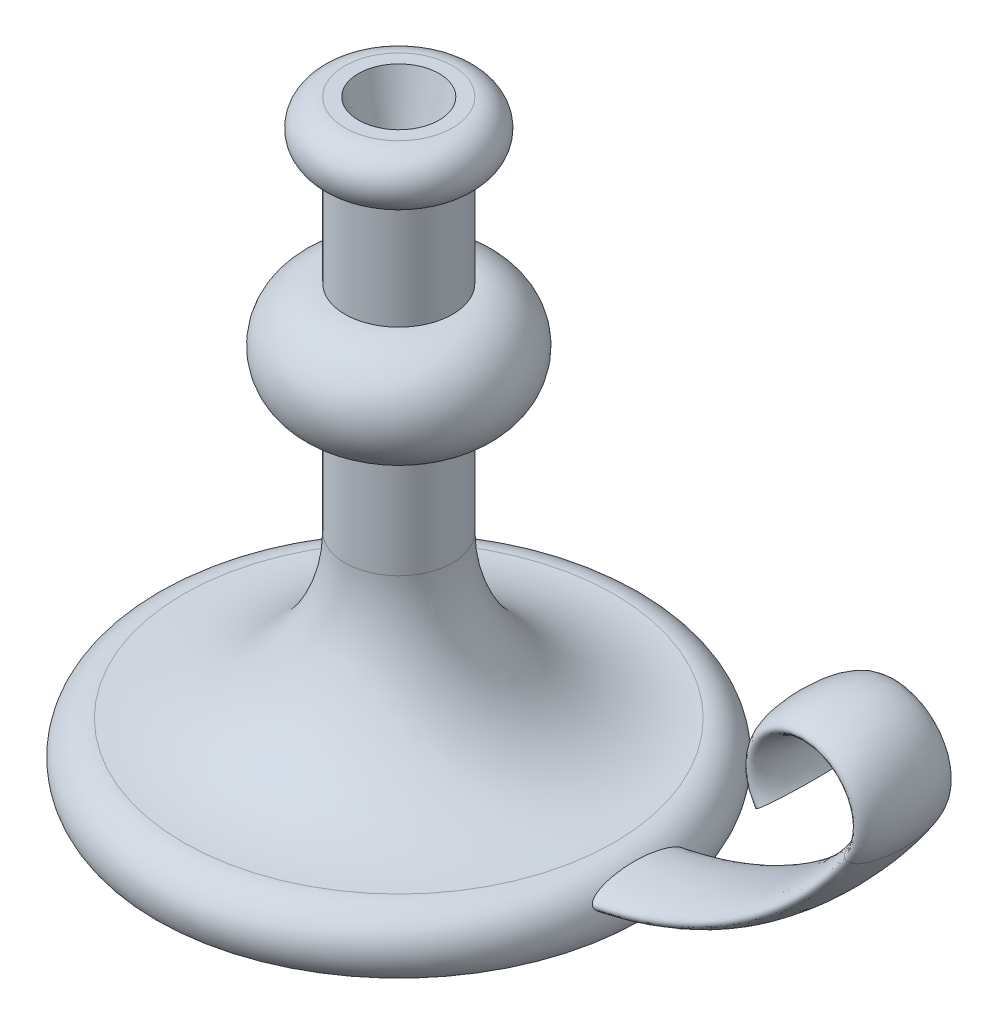
ISO-10303-21;
HEADER;
FILE_DESCRIPTION(('STEP AP214'),'2;1');
FILE_NAME('part.step','',(''),(''),'','','');
FILE_SCHEMA(('AUTOMOTIVE_DESIGN { 1 0 10303 214 1 1 1 1 }'));
ENDSEC;
DATA;
#1=APPLICATION_CONTEXT('core data for automotive mechanical design processes');
#2=APPLICATION_PROTOCOL_DEFINITION('international standard','automotive_design',2000,#1);
#3=PRODUCT_CONTEXT('',#1,'mechanical');
#4=PRODUCT('Part','Part','',(#3));
#5=PRODUCT_RELATED_PRODUCT_CATEGORY('part','',(#4));
#6=PRODUCT_DEFINITION_FORMATION('','',#4);
#7=PRODUCT_DEFINITION_CONTEXT('part definition',#1,'design');
#8=PRODUCT_DEFINITION('design','',#6,#7);
#9=PRODUCT_DEFINITION_SHAPE('','',#8);
#10=(LENGTH_UNIT() NAMED_UNIT(*) SI_UNIT(.MILLI.,.METRE.));
#11=(NAMED_UNIT(*) PLANE_ANGLE_UNIT() SI_UNIT($,.RADIAN.));
#12=(NAMED_UNIT(*) SI_UNIT($,.STERADIAN.) SOLID_ANGLE_UNIT());
#13=UNCERTAINTY_MEASURE_WITH_UNIT(LENGTH_MEASURE(1.E-05),#10,'distance_accuracy_value','');
#14=(GEOMETRIC_REPRESENTATION_CONTEXT(3) GLOBAL_UNCERTAINTY_ASSIGNED_CONTEXT((#13)) GLOBAL_UNIT_ASSIGNED_CONTEXT((#10,
#11,#12)) REPRESENTATION_CONTEXT('',''));
#15=CARTESIAN_POINT('',(0.,0.,0.));
#16=DIRECTION('',(0.,0.,1.));
#17=DIRECTION('',(1.,0.,0.));
#18=AXIS2_PLACEMENT_3D('',#15,#16,#17);
#19=CARTESIAN_POINT('',(0.,7.50000000000001,0.));
#20=DIRECTION('',(0.,1.,0.));
#21=DIRECTION('',(-1.,0.,0.));
#22=AXIS2_PLACEMENT_3D('',#19,#20,#21);
#23=TOROIDAL_SURFACE('',#22,80.,12.5);
#24=CARTESIAN_POINT('',(89.5597422043342,12.9414346567556,-17.5));
#25=CARTESIAN_POINT('',(89.5390618403561,12.9834100865229,-17.4999996776707));
#26=CARTESIAN_POINT('',(89.5184817634659,13.0254349004938,-17.4978446678338));
#27=CARTESIAN_POINT('',(89.4776811982743,13.1092324497794,-17.4892861575811));
#28=CARTESIAN_POINT('',(89.457460843071,13.1510050881611,-17.4828811168849));
#29=CARTESIAN_POINT('',(89.397540281121,13.2754779151414,-17.4575154450277));
#30=CARTESIAN_POINT('',(89.3585808220613,13.357332519418,-17.4324042670615));
#31=CARTESIAN_POINT('',(89.2734407804368,13.537917999339,-17.3597430943198));
#32=CARTESIAN_POINT('',(89.2281116968574,13.6353152430682,-17.3079906529225));
#33=CARTESIAN_POINT('',(89.1421567137609,13.821757010941,-17.1881654215547));
#34=CARTESIAN_POINT('',(89.1015409681601,13.9107834263932,-17.1200583326704));
#35=CARTESIAN_POINT('',(89.0298799325305,14.0690063055582,-16.9825317839868));
#36=CARTESIAN_POINT('',(88.9982856031081,14.1392491335227,-16.9145677994464));
#37=CARTESIAN_POINT('',(88.9378435588022,14.2742914925202,-16.7722502997375));
#38=CARTESIAN_POINT('',(88.9089980734781,14.3390866000317,-16.6978916893925));
#39=CARTESIAN_POINT('',(88.8536099995593,14.4639626152392,-16.5442177801531));
#40=CARTESIAN_POINT('',(88.8270733532936,14.5240313225779,-16.4648905452804));
#41=CARTESIAN_POINT('',(88.7760376587064,14.6398576639347,-16.3025863942461));
#42=CARTESIAN_POINT('',(88.7515379613228,14.6956166708124,-16.2196106536441));
#43=CARTESIAN_POINT('',(88.704732820549,14.8023169553036,-16.052427362784));
#44=CARTESIAN_POINT('',(88.6823939519366,14.8533308765833,-15.9682752160745));
#45=CARTESIAN_POINT('',(88.639155365759,14.9521540950118,-15.797741621076));
#46=CARTESIAN_POINT('',(88.6182558899722,14.9999628537458,-15.711359801597));
#47=CARTESIAN_POINT('',(88.5573681790009,15.1392585624724,-15.4492483073626));
#48=CARTESIAN_POINT('',(88.5192579811328,15.2264609786255,-15.2707999543232));
#49=CARTESIAN_POINT('',(88.4468979005836,15.3916731276291,-14.9088289385944));
#50=CARTESIAN_POINT('',(88.4126513155026,15.4696750103546,-14.725302105289));
#51=CARTESIAN_POINT('',(88.347139159504,15.6182965032923,-14.3538259785736));
#52=CARTESIAN_POINT('',(88.3158872528146,15.6888824046966,-14.1658608782527));
#53=CARTESIAN_POINT('',(88.2560127035516,15.8233792512431,-13.787400391854));
#54=CARTESIAN_POINT('',(88.2273872233002,15.8872974109117,-13.5969079973403));
#55=CARTESIAN_POINT('',(88.1723348827448,16.0094159388249,-13.213849673779));
#56=CARTESIAN_POINT('',(88.1459074726896,16.0676177374301,-13.021284276893));
#57=CARTESIAN_POINT('',(88.0884248304702,16.1932687928886,-12.5849658119247));
#58=CARTESIAN_POINT('',(88.0579162002184,16.2592725226906,-12.3407253521734));
#59=CARTESIAN_POINT('',(87.9994625659013,16.3844358500306,-11.8501803460782));
#60=CARTESIAN_POINT('',(87.9715178234088,16.4435947494062,-11.6038755919222));
#61=CARTESIAN_POINT('',(87.9178897421858,16.5558889779776,-11.109529987048));
#62=CARTESIAN_POINT('',(87.8922075114269,16.6090213595568,-10.86148834924));
#63=CARTESIAN_POINT('',(87.8429155378603,16.7098546386226,-10.3640943607018));
#64=CARTESIAN_POINT('',(87.8193058942812,16.7575552760879,-10.1147419478211));
#65=CARTESIAN_POINT('',(87.7514718906047,16.8930622945828,-9.36631396644906));
#66=CARTESIAN_POINT('',(87.710111419914,16.97354616682,-8.86564202060321));
#67=CARTESIAN_POINT('',(87.6344118706354,17.1178657179368,-7.86153551840237));
#68=CARTESIAN_POINT('',(87.600071334108,17.1817048544489,-7.35810155802573));
#69=CARTESIAN_POINT('',(87.5383679228555,17.2943697092708,-6.35225136111884));
#70=CARTESIAN_POINT('',(87.5109639050819,17.3432843238913,-5.84984753787566));
#71=CARTESIAN_POINT('',(87.4628391630611,17.4279603163538,-4.84354228831021));
#72=CARTESIAN_POINT('',(87.4421195253372,17.4637195559667,-4.339640631941));
#73=CARTESIAN_POINT('',(87.4074386787955,17.5229738360405,-3.33084363886024));
#74=CARTESIAN_POINT('',(87.3934780874882,17.5464677559496,-2.82594821558692));
#75=CARTESIAN_POINT('',(87.3724154174235,17.581727316861,-1.81615213380814));
#76=CARTESIAN_POINT('',(87.3653059747339,17.5935055508652,-1.31125206554532));
#77=CARTESIAN_POINT('',(87.3579750479624,17.605648406649,-0.301318309133024));
#78=CARTESIAN_POINT('',(87.357752858235,17.6060141977103,0.203715360025975));
#79=CARTESIAN_POINT('',(87.3641963426438,17.5953454261039,1.21356726554157));
#80=CARTESIAN_POINT('',(87.3708612610896,17.5843121142069,1.71838551945497));
#81=CARTESIAN_POINT('',(87.3886163883338,17.5546163065411,2.60695068649841));
#82=CARTESIAN_POINT('',(87.3982690399212,17.5384060734754,2.99081046478827));
#83=CARTESIAN_POINT('',(87.4214966880659,17.4990063104015,3.758070027857));
#84=CARTESIAN_POINT('',(87.435071823598,17.4758165331044,4.14146979585417));
#85=CARTESIAN_POINT('',(87.4661109016121,17.4221255760208,4.90767543763198));
#86=CARTESIAN_POINT('',(87.4835755913649,17.3916229911935,5.29048118303748));
#87=CARTESIAN_POINT('',(87.5224765269599,17.3226675403928,6.05728766608026));
#88=CARTESIAN_POINT('',(87.5439339089184,17.2841722314847,6.44128353835432));
#89=CARTESIAN_POINT('',(87.5907685418077,17.1987228636429,7.20803081067547));
#90=CARTESIAN_POINT('',(87.6161451191905,17.1517702579396,7.59078241304221));
#91=CARTESIAN_POINT('',(87.6708875244928,17.0486132676473,8.35453102594106));
#92=CARTESIAN_POINT('',(87.7002509792863,16.9924143825779,8.73552894189127));
#93=CARTESIAN_POINT('',(87.7555693385741,16.8844873931685,9.40362807317337));
#94=CARTESIAN_POINT('',(87.7806318626291,16.8349635590469,9.69115955865554));
#95=CARTESIAN_POINT('',(87.8333287645208,16.7293167465829,10.2648242071222));
#96=CARTESIAN_POINT('',(87.8609635304672,16.6731927720485,10.5509571522122));
#97=CARTESIAN_POINT('',(87.9190678138249,16.5534902310352,11.1217112831612));
#98=CARTESIAN_POINT('',(87.9495404231884,16.4899035134826,11.4063304543324));
#99=CARTESIAN_POINT('',(88.0137266324375,16.3541216812727,11.9738772339476));
#100=CARTESIAN_POINT('',(88.0474477220507,16.2819065762202,12.2567992545898));
#101=CARTESIAN_POINT('',(88.1183718381953,16.1280994435204,12.8175821097588));
#102=CARTESIAN_POINT('',(88.1555499028383,16.0465737963571,13.0954641920682));
#103=CARTESIAN_POINT('',(88.2343580118385,15.8719007074314,13.6468218234686));
#104=CARTESIAN_POINT('',(88.2759857295858,15.7787593350285,13.9202995902182));
#105=CARTESIAN_POINT('',(88.3426568223939,15.628384040649,14.3254052817091));
#106=CARTESIAN_POINT('',(88.3655500017785,15.5765627213432,14.459402316928));
#107=CARTESIAN_POINT('',(88.4129882653633,15.4688611687535,14.7254525655375));
#108=CARTESIAN_POINT('',(88.437533168995,15.4129813790936,14.8575059894886));
#109=CARTESIAN_POINT('',(88.4884967907572,15.2967269720351,15.1188747284343));
#110=CARTESIAN_POINT('',(88.5149109123159,15.2363633637366,15.2481958098579));
#111=CARTESIAN_POINT('',(88.5700241751771,15.1103179001212,15.5037035642081));
#112=CARTESIAN_POINT('',(88.5987227483177,15.0446373670989,15.6298910063173));
#113=CARTESIAN_POINT('',(88.6570151826478,14.9113179601609,15.8704199707059));
#114=CARTESIAN_POINT('',(88.686441736786,14.844056340729,15.985009599526));
#115=CARTESIAN_POINT('',(88.7482816567768,14.7030103830827,16.2094581395952));
#116=CARTESIAN_POINT('',(88.7806974756141,14.6292206899981,16.3193130551168));
#117=CARTESIAN_POINT('',(88.8489097184972,14.4745639616532,16.5315146626623));
#118=CARTESIAN_POINT('',(88.8846785573508,14.3937550191612,16.6339121024916));
#119=CARTESIAN_POINT('',(88.9606113704153,14.2232561160767,16.8291907541922));
#120=CARTESIAN_POINT('',(89.0007675950253,14.1335818404866,16.9220882016582));
#121=CARTESIAN_POINT('',(89.0601235459872,14.0021924630805,17.0411637727684));
#122=CARTESIAN_POINT('',(89.0770574086405,13.9648250339928,17.0732949178269));
#123=CARTESIAN_POINT('',(89.1117704043089,13.8885105828123,17.1351129203988));
#124=CARTESIAN_POINT('',(89.1295494801998,13.8495636674962,17.1647999427301));
#125=CARTESIAN_POINT('',(89.1842722230347,13.7301865324198,17.2496672583031));
#126=CARTESIAN_POINT('',(89.2225929343976,13.6472387371287,17.3006362954166));
#127=CARTESIAN_POINT('',(89.2830198855204,13.5177923286577,17.3659392171784));
#128=CARTESIAN_POINT('',(89.3038035106325,13.4734899832392,17.385944655127));
#129=CARTESIAN_POINT('',(89.346235727213,13.3835498526412,17.421521231844));
#130=CARTESIAN_POINT('',(89.3678838017235,13.3379128698458,17.4370949768747));
#131=CARTESIAN_POINT('',(89.411904802424,13.2456714845449,17.4633118273198));
#132=CARTESIAN_POINT('',(89.4342765183816,13.1990687398025,17.4739627514632));
#133=CARTESIAN_POINT('',(89.4796070415906,13.1052444737538,17.4900003628641));
#134=CARTESIAN_POINT('',(89.5025657624808,13.0580230439623,17.4953878199709));
#135=CARTESIAN_POINT('',(89.5464271716018,12.9684112208446,17.5004320668286));
#136=CARTESIAN_POINT('',(89.5672934245651,12.9260327119427,17.5006298436875));
#137=CARTESIAN_POINT('',(89.6091580078856,12.8415284156484,17.496667300483));
#138=CARTESIAN_POINT('',(89.6301563797468,12.7994027167222,17.4925055351934));
#139=CARTESIAN_POINT('',(89.672115635143,12.7157496198109,17.479965082583));
#140=CARTESIAN_POINT('',(89.6930765014329,12.6742224548789,17.4715847960013));
#141=CARTESIAN_POINT('',(89.7348115258834,12.5920532516239,17.4508625220261));
#142=CARTESIAN_POINT('',(89.755585576578,12.5514117057389,17.4385183877269));
#143=CARTESIAN_POINT('',(89.8013847331777,12.4623676182577,17.407062698976));
#144=CARTESIAN_POINT('',(89.8263321178974,12.4142402057079,17.3870577635768));
#145=CARTESIAN_POINT('',(89.8756026524762,12.319894282953,17.3423007335128));
#146=CARTESIAN_POINT('',(89.8999253272692,12.2736772101064,17.317545140678));
#147=CARTESIAN_POINT('',(89.9718636752115,12.1379719567039,17.2371059859825));
#148=CARTESIAN_POINT('',(90.0184026508768,12.051520920799,17.1752845379973));
#149=CARTESIAN_POINT('',(90.1015176697338,11.8991704299987,17.0502729237444));
#150=CARTESIAN_POINT('',(90.1385373685484,11.832138329749,16.9886971231214));
#151=CARTESIAN_POINT('',(90.2104869329279,11.7032426034952,16.8591573255863));
#152=CARTESIAN_POINT('',(90.2454151408799,11.641383062009,16.7911883686367));
#153=CARTESIAN_POINT('',(90.3133841124365,11.5222099067343,16.6502911436158));
#154=CARTESIAN_POINT('',(90.3464212107124,11.4649050425001,16.5773538074551));
#155=CARTESIAN_POINT('',(90.4107258034174,11.3544143267813,16.427734996584));
#156=CARTESIAN_POINT('',(90.4419937497579,11.3012274221163,16.3510544874359));
#157=CARTESIAN_POINT('',(90.5066142435687,11.1922810586097,16.185318952537));
#158=CARTESIAN_POINT('',(90.5397652495639,11.1369814833087,16.0958847835332));
#159=CARTESIAN_POINT('',(90.6043042941241,11.0303194621558,15.9140859303206));
#160=CARTESIAN_POINT('',(90.6356921559875,10.978957410734,15.8217209538336));
#161=CARTESIAN_POINT('',(90.696838387797,10.8797698841651,15.6347974994414));
#162=CARTESIAN_POINT('',(90.7265992701636,10.8319389137698,15.5402427441421));
#163=CARTESIAN_POINT('',(90.7846969346251,10.7393295137682,15.3492353522606));
#164=CARTESIAN_POINT('',(90.8130337948203,10.6945509167067,15.2527828201665));
#165=CARTESIAN_POINT('',(90.8771212205239,10.594058959755,15.0277319837684));
#166=CARTESIAN_POINT('',(90.9124022819657,10.5393328792866,14.8985593440142));
#167=CARTESIAN_POINT('',(90.9809741103801,10.4339610325185,14.638032843261));
#168=CARTESIAN_POINT('',(91.0142645951402,10.3833158444318,14.5066786763349));
#169=CARTESIAN_POINT('',(91.1115171918212,10.2366440116077,14.1096810918782));
#170=CARTESIAN_POINT('',(91.1727828792966,10.1460018602115,13.841380042592));
#171=CARTESIAN_POINT('',(91.2892862812459,9.97615455726923,13.2997906638461));
#172=CARTESIAN_POINT('',(91.3445203789087,9.89695625887047,13.0264994554538));
#173=CARTESIAN_POINT('',(91.4499805719979,9.74769654866275,12.474859415595));
#174=CARTESIAN_POINT('',(91.5001780442571,9.67768673078028,12.19649125367));
#175=CARTESIAN_POINT('',(91.5957501918067,9.54592534416398,11.6372393425747));
#176=CARTESIAN_POINT('',(91.6411285723793,9.4841674211764,11.3563577087909));
#177=CARTESIAN_POINT('',(91.7275132616963,9.36779787162559,10.7925089006679));
#178=CARTESIAN_POINT('',(91.7685202729419,9.31318509647934,10.5095420692685));
#179=CARTESIAN_POINT('',(91.8503345045436,9.20520508711817,9.9138715021363));
#180=CARTESIAN_POINT('',(91.8907217744487,9.15249390095823,9.60099168323611));
#181=CARTESIAN_POINT('',(91.9669218199108,9.05389158705544,8.97359688181949));
#182=CARTESIAN_POINT('',(92.002734366163,9.00800080116149,8.65908181815924));
#183=CARTESIAN_POINT('',(92.07003298894,8.92240020575317,8.0286556880876));
#184=CARTESIAN_POINT('',(92.1015177516249,8.88269227276205,7.71274422766477));
#185=CARTESIAN_POINT('',(92.1603325838502,8.80898713679315,7.07986626810596));
#186=CARTESIAN_POINT('',(92.1876625005419,8.7749901439051,6.76289973059385));
#187=CARTESIAN_POINT('',(92.263503001365,8.68114273902108,5.81249868362224));
#188=CARTESIAN_POINT('',(92.3060517448553,8.62919999492199,5.1777874719385));
#189=CARTESIAN_POINT('',(92.3760091017524,8.54431318450696,3.90627938186834));
#190=CARTESIAN_POINT('',(92.4034169750228,8.51137004695194,3.26948240305299));
#191=CARTESIAN_POINT('',(92.4435085691827,8.46331702284125,1.9954574177846));
#192=CARTESIAN_POINT('',(92.4562084043365,8.44818761908851,1.35823064985437));
#193=CARTESIAN_POINT('',(92.4671302630246,8.43517103988555,0.0834423270817521));
#194=CARTESIAN_POINT('',(92.4653514271759,8.43728488791035,-0.554119245387092));
#195=CARTESIAN_POINT('',(92.4472853754493,8.45883344750922,-1.82886328296885));
#196=CARTESIAN_POINT('',(92.4309954438924,8.47827140120328,-2.46604565477996));
#197=CARTESIAN_POINT('',(92.383659062641,8.53514174464791,-3.739025838669));
#198=CARTESIAN_POINT('',(92.3526140808133,8.57257234445215,-4.37482378215398));
#199=CARTESIAN_POINT('',(92.2921790866404,8.6462132919499,-5.36625544460873));
#200=CARTESIAN_POINT('',(92.2680118235609,8.67578736963474,-5.72271555901762));
#201=CARTESIAN_POINT('',(92.2147013952356,8.74146404735384,-6.43465819603197));
#202=CARTESIAN_POINT('',(92.1855583836334,8.7775664458053,-6.79014074847879));
#203=CARTESIAN_POINT('',(92.1221127048894,8.85679311513341,-7.49983836059385));
#204=CARTESIAN_POINT('',(92.0878103957549,8.89991689880813,-7.85405350646369));
#205=CARTESIAN_POINT('',(92.0137981226251,8.99384143269639,-8.56089767223827));
#206=CARTESIAN_POINT('',(91.9740883343959,9.04464193338969,-8.91352674331252));
#207=CARTESIAN_POINT('',(91.9015818240064,9.13842562293705,-9.51226790233029));
#208=CARTESIAN_POINT('',(91.8702370654072,9.17924629619424,-9.75889575934117));
#209=CARTESIAN_POINT('',(91.8045624920058,9.26550036635901,-10.2509419620294));
#210=CARTESIAN_POINT('',(91.7702327567071,9.31093364041757,-10.4963603397368));
#211=CARTESIAN_POINT('',(91.6984266463272,9.40685898724869,-10.9855805665729));
#212=CARTESIAN_POINT('',(91.6609523533817,9.45734771681954,-11.229383371816));
#213=CARTESIAN_POINT('',(91.5826038967893,9.56401317099014,-11.7151775621041));
#214=CARTESIAN_POINT('',(91.5417298772537,9.62018965451302,-11.9571690234569));
#215=CARTESIAN_POINT('',(91.4386423376747,9.76351210996371,-12.5384162018479));
#216=CARTESIAN_POINT('',(91.3745858903289,9.85386844470734,-12.8765786557766));
#217=CARTESIAN_POINT('',(91.2720163238268,10.0014015523805,-13.3793136041307));
#218=CARTESIAN_POINT('',(91.2367090969993,10.0526332971692,-13.5462966135002));
#219=CARTESIAN_POINT('',(91.1637294936458,10.1596261841617,-13.878285337955));
#220=CARTESIAN_POINT('',(91.1260572231723,10.2153871233018,-14.043291141307));
#221=CARTESIAN_POINT('',(91.0448513753998,10.3369382727867,-14.3844416693125));
#222=CARTESIAN_POINT('',(91.0010908407916,10.4031767890597,-14.5603739146111));
#223=CARTESIAN_POINT('',(90.9100440331647,10.5428509324197,-14.9085311659828));
#224=CARTESIAN_POINT('',(90.8627565865346,10.6162889577862,-15.0807549132311));
#225=CARTESIAN_POINT('',(90.7642492199855,10.7715651970481,-15.41954960373));
#226=CARTESIAN_POINT('',(90.7130423069867,10.8533759065567,-15.5861368065582));
#227=CARTESIAN_POINT('',(90.6058220172114,11.0275348916428,-15.9120386126947));
#228=CARTESIAN_POINT('',(90.5498128203452,11.119874025908,-16.0713593593321));
#229=CARTESIAN_POINT('',(90.4444082893051,11.296925592034,-16.3465910082039));
#230=CARTESIAN_POINT('',(90.3961277047705,11.3791055101424,-16.4645448336187));
#231=CARTESIAN_POINT('',(90.2950977924849,11.5538633486866,-16.691156614655));
#232=CARTESIAN_POINT('',(90.2423390562533,11.6464633011953,-16.7997939840166));
#233=CARTESIAN_POINT('',(90.1590440243458,11.7953014200273,-16.9524870890685));
#234=CARTESIAN_POINT('',(90.1303607600848,11.8469859215397,-17.001997718978));
#235=CARTESIAN_POINT('',(90.0716181087375,11.9538274561509,-17.0963102611098));
#236=CARTESIAN_POINT('',(90.0415584049395,12.0089852895523,-17.1411110817338));
#237=CARTESIAN_POINT('',(89.9801756575597,12.1227246632089,-17.2246441347397));
#238=CARTESIAN_POINT('',(89.9488577537651,12.1812926416248,-17.2633984155372));
#239=CARTESIAN_POINT('',(89.8849549671329,12.3020144005061,-17.3335784406431));
#240=CARTESIAN_POINT('',(89.8523712452274,12.3641649194655,-17.3650107233704));
#241=CARTESIAN_POINT('',(89.7981176909034,12.4687258013535,-17.4092508881815));
#242=CARTESIAN_POINT('',(89.7767436177656,12.5101841078545,-17.4246893204628));
#243=CARTESIAN_POINT('',(89.7336969050675,12.5942336377178,-17.4515182330193));
#244=CARTESIAN_POINT('',(89.7120243813912,12.6368244270179,-17.4629102408532));
#245=CARTESIAN_POINT('',(89.6685521390583,12.7228207531292,-17.4812886417918));
#246=CARTESIAN_POINT('',(89.6467526103346,12.766225219827,-17.488280453409));
#247=CARTESIAN_POINT('',(89.6031794397246,12.8535466229688,-17.4976362320133));
#248=CARTESIAN_POINT('',(89.5814057970823,12.8974635440192,-17.5000003376542));
#249=CARTESIAN_POINT('',(89.5597422043342,12.9414346567556,-17.5));
#250=B_SPLINE_CURVE_WITH_KNOTS('',3,(#24,#25,#26,#27,#28,#29,#30,#31,#32,#33,#34,#35,#36,#37,
#38,#39,#40,#41,#42,#43,#44,#45,#46,#47,#48,#49,#50,#51,#52,#53,#54,#55,#56,#57,#58,#59,#60,#61,
#62,#63,#64,#65,#66,#67,#68,#69,#70,#71,#72,#73,#74,#75,#76,#77,#78,#79,#80,#81,#82,#83,#84,#85,
#86,#87,#88,#89,#90,#91,#92,#93,#94,#95,#96,#97,#98,#99,#100,#101,#102,#103,#104,#105,#106,#107,
#108,#109,#110,#111,#112,#113,#114,#115,#116,#117,#118,#119,#120,#121,#122,#123,#124,#125,#126,
#127,#128,#129,#130,#131,#132,#133,#134,#135,#136,#137,#138,#139,#140,#141,#142,#143,#144,#145,
#146,#147,#148,#149,#150,#151,#152,#153,#154,#155,#156,#157,#158,#159,#160,#161,#162,#163,#164,
#165,#166,#167,#168,#169,#170,#171,#172,#173,#174,#175,#176,#177,#178,#179,#180,#181,#182,#183,
#184,#185,#186,#187,#188,#189,#190,#191,#192,#193,#194,#195,#196,#197,#198,#199,#200,#201,#202,
#203,#204,#205,#206,#207,#208,#209,#210,#211,#212,#213,#214,#215,#216,#217,#218,#219,#220,#221,
#222,#223,#224,#225,#226,#227,#228,#229,#230,#231,#232,#233,#234,#235,#236,#237,#238,#239,#240,
#241,#242,#243,#244,#245,#246,#247,#248,#249),.UNSPECIFIED.,.T.,.F.,(4,2,2,2,2,2,2,2,2,2,2,2,2,
2,2,2,2,2,2,2,2,2,2,2,2,2,2,2,2,2,2,2,2,2,2,2,2,2,2,2,2,2,2,2,2,2,2,2,2,2,2,2,2,2,2,2,2,2,2,2,2,
2,2,2,2,2,2,2,2,2,2,2,2,2,2,2,2,2,2,2,2,2,2,2,2,2,2,2,2,2,2,2,2,2,2,2,2,2,2,2,2,2,2,2,2,2,2,2,2,
2,2,2,4),(0.,0.140326879649319,0.280704643844317,0.56146180649996,0.917225717585815,
1.27374235386085,1.58146302398147,1.88943119593641,2.19816989275475,2.50680983170025,
2.80944292372748,3.11212672643255,3.71838915770192,4.32516518168244,4.9345897078254,
5.54334784093533,6.15195325906644,6.9163191102904,7.68076285707081,8.44557890144719,
9.21043154271123,10.7363530227226,12.261957268085,13.7782885580522,15.2948661984782,
16.8115823682401,18.3266664767783,19.8415953542034,21.3563580231467,22.5092504482306,
23.6621837256807,24.8153386988897,25.974781379963,27.1340250219353,28.2925816429424,
29.1710242088837,30.0495995331113,30.9291435591541,31.8107663507033,32.6864555684206,
33.5616891298975,33.9980703124476,34.4344038665402,34.8696994156046,35.3048870393029,
35.7129485465612,36.1213479397352,36.5266413619583,36.9312301321629,37.087481072601,
37.2437214677037,37.5562829439449,37.7147148343191,37.8730533580126,38.0311395270882,
38.1892025705741,38.3307149014328,38.4722741597123,38.6138871242241,38.7555769191151,
38.9286541005772,39.1018592207181,39.4485901352339,39.7429975955385,40.037635381819,
40.3328261359406,40.6279411430421,40.9585479808934,41.2891878931728,41.6193018978015,
41.9493977775689,42.3832551508598,42.8171738887968,43.6859467918766,44.5552378220699,
45.429218266336,46.3025217875277,47.1756847521808,48.1351081860329,49.0945796914518,
50.0543418354857,51.0141392787929,52.9283366636006,54.8426276125079,56.7548192562806,
58.6671243992157,60.5797874956857,62.4922603557689,63.5676819321841,64.6430703071868,
65.7183840946021,66.7936629380618,67.5494303160598,68.3051775707186,69.0604283053772,
69.8156470419349,70.8826765887348,71.4172057561795,71.9517109715325,72.5305894861724,
73.1096614946431,73.6868888443991,74.263618778701,74.7180950553374,75.1735510009088,
75.40468536688,75.6358731855894,75.8661972266864,76.0963147970917,76.2435550398534,
76.3907396389802,76.5377426347989,76.6847412260987),.UNSPECIFIED.);
#251=CARTESIAN_POINT('',(89.5597422043342,12.9414346567556,-17.5));
#252=VERTEX_POINT('',#251);
#253=EDGE_CURVE('E11',#252,#252,#250,.T.);
#254=ORIENTED_EDGE('',*,*,#253,.F.);
#255=EDGE_LOOP('',(#254));
#256=FACE_BOUND('',#255,.T.);
#257=CARTESIAN_POINT('',(0.,0.,0.));
#258=DIRECTION('',(0.,1.,0.));
#259=DIRECTION('',(-1.,0.,0.));
#260=AXIS2_PLACEMENT_3D('',#257,#258,#259);
#261=CIRCLE('',#260,90.);
#262=CARTESIAN_POINT('',(-90.,0.,0.));
#263=VERTEX_POINT('',#262);
#264=EDGE_CURVE('E58',#263,#263,#261,.T.);
#265=ORIENTED_EDGE('',*,*,#264,.T.);
#266=EDGE_LOOP('',(#265));
#267=FACE_BOUND('',#266,.T.);
#268=CARTESIAN_POINT('',(0.,20.,0.));
#269=DIRECTION('',(0.,1.,0.));
#270=DIRECTION('',(-1.,0.,0.));
#271=AXIS2_PLACEMENT_3D('',#268,#269,#270);
#272=CIRCLE('',#271,80.);
#273=CARTESIAN_POINT('',(-80.,20.,0.));
#274=VERTEX_POINT('',#273);
#275=EDGE_CURVE('E50',#274,#274,#272,.T.);
#276=ORIENTED_EDGE('',*,*,#275,.F.);
#277=EDGE_LOOP('',(#276));
#278=FACE_BOUND('',#277,.T.);
#279=ADVANCED_FACE('F38',(#256,#267,#278),#23,.T.);
#280=CARTESIAN_POINT('',(0.,80.,0.));
#281=DIRECTION('',(0.,1.,0.));
#282=DIRECTION('',(-1.,0.,0.));
#283=AXIS2_PLACEMENT_3D('',#280,#281,#282);
#284=TOROIDAL_SURFACE('',#283,80.,60.);
#285=ORIENTED_EDGE('',*,*,#275,.T.);
#286=EDGE_LOOP('',(#285));
#287=FACE_BOUND('',#286,.T.);
#288=CARTESIAN_POINT('',(0.,80.,0.));
#289=DIRECTION('',(0.,1.,0.));
#290=DIRECTION('',(-1.,0.,0.));
#291=AXIS2_PLACEMENT_3D('',#288,#289,#290);
#292=CIRCLE('',#291,20.);
#293=CARTESIAN_POINT('',(-20.,80.,0.));
#294=VERTEX_POINT('',#293);
#295=EDGE_CURVE('E86',#294,#294,#292,.T.);
#296=ORIENTED_EDGE('',*,*,#295,.F.);
#297=EDGE_LOOP('',(#296));
#298=FACE_BOUND('',#297,.T.);
#299=ADVANCED_FACE('F93',(#287,#298),#284,.F.);
#300=CARTESIAN_POINT('',(0.,220.,0.));
#301=DIRECTION('',(0.,1.,0.));
#302=DIRECTION('',(-1.,0.,0.));
#303=AXIS2_PLACEMENT_3D('',#300,#301,#302);
#304=CYLINDRICAL_SURFACE('',#303,20.);
#305=ORIENTED_EDGE('',*,*,#295,.T.);
#306=EDGE_LOOP('',(#305));
#307=FACE_BOUND('',#306,.T.);
#308=CARTESIAN_POINT('',(0.,120.,0.));
#309=DIRECTION('',(0.,1.,0.));
#310=DIRECTION('',(-1.,0.,0.));
#311=AXIS2_PLACEMENT_3D('',#308,#309,#310);
#312=CIRCLE('',#311,20.);
#313=CARTESIAN_POINT('',(-20.,120.,0.));
#314=VERTEX_POINT('',#313);
#315=EDGE_CURVE('E82',#314,#314,#312,.T.);
#316=ORIENTED_EDGE('',*,*,#315,.F.);
#317=EDGE_LOOP('',(#316));
#318=FACE_BOUND('',#317,.T.);
#319=ADVANCED_FACE('F101',(#307,#318),#304,.T.);
#320=CARTESIAN_POINT('',(0.,140.,0.));
#321=DIRECTION('',(0.,1.,0.));
#322=DIRECTION('',(-1.,0.,0.));
#323=AXIS2_PLACEMENT_3D('',#320,#321,#322);
#324=TOROIDAL_SURFACE('',#323,20.,20.);
#325=ORIENTED_EDGE('',*,*,#315,.T.);
#326=EDGE_LOOP('',(#325));
#327=FACE_BOUND('',#326,.T.);
#328=CARTESIAN_POINT('',(0.,160.,0.));
#329=DIRECTION('',(0.,1.,0.));
#330=DIRECTION('',(-1.,0.,0.));
#331=AXIS2_PLACEMENT_3D('',#328,#329,#330);
#332=CIRCLE('',#331,20.);
#333=CARTESIAN_POINT('',(-20.,160.,0.));
#334=VERTEX_POINT('',#333);
#335=EDGE_CURVE('E78',#334,#334,#332,.T.);
#336=ORIENTED_EDGE('',*,*,#335,.F.);
#337=EDGE_LOOP('',(#336));
#338=FACE_BOUND('',#337,.T.);
#339=ADVANCED_FACE('F171',(#327,#338),#324,.T.);
#340=CARTESIAN_POINT('',(0.,220.,0.));
#341=DIRECTION('',(0.,1.,0.));
#342=DIRECTION('',(-1.,0.,0.));
#343=AXIS2_PLACEMENT_3D('',#340,#341,#342);
#344=CYLINDRICAL_SURFACE('',#343,20.);
#345=ORIENTED_EDGE('',*,*,#335,.T.);
#346=EDGE_LOOP('',(#345));
#347=FACE_BOUND('',#346,.T.);
#348=CARTESIAN_POINT('',(0.,200.,0.));
#349=DIRECTION('',(0.,1.,0.));
#350=DIRECTION('',(-1.,0.,0.));
#351=AXIS2_PLACEMENT_3D('',#348,#349,#350);
#352=CIRCLE('',#351,20.);
#353=CARTESIAN_POINT('',(-20.,200.,0.));
#354=VERTEX_POINT('',#353);
#355=EDGE_CURVE('E74',#354,#354,#352,.T.);
#356=ORIENTED_EDGE('',*,*,#355,.F.);
#357=EDGE_LOOP('',(#356));
#358=FACE_BOUND('',#357,.T.);
#359=ADVANCED_FACE('F165',(#347,#358),#344,.T.);
#360=CARTESIAN_POINT('',(0.,210.,0.));
#361=DIRECTION('',(0.,1.,0.));
#362=DIRECTION('',(-1.,0.,0.));
#363=AXIS2_PLACEMENT_3D('',#360,#361,#362);
#364=TOROIDAL_SURFACE('',#363,20.,10.);
#365=ORIENTED_EDGE('',*,*,#355,.T.);
#366=EDGE_LOOP('',(#365));
#367=FACE_BOUND('',#366,.T.);
#368=CARTESIAN_POINT('',(0.,220.,0.));
#369=DIRECTION('',(0.,1.,0.));
#370=DIRECTION('',(-1.,0.,0.));
#371=AXIS2_PLACEMENT_3D('',#368,#369,#370);
#372=CIRCLE('',#371,20.);
#373=CARTESIAN_POINT('',(-20.,220.,0.));
#374=VERTEX_POINT('',#373);
#375=EDGE_CURVE('E64',#374,#374,#372,.T.);
#376=ORIENTED_EDGE('',*,*,#375,.F.);
#377=EDGE_LOOP('',(#376));
#378=FACE_BOUND('',#377,.T.);
#379=ADVANCED_FACE('F118',(#367,#378),#364,.T.);
#380=CARTESIAN_POINT('',(-3.05311331771918E-13,220.,0.));
#381=DIRECTION('',(0.,1.,0.));
#382=DIRECTION('',(-1.,0.,0.));
#383=AXIS2_PLACEMENT_3D('',#380,#381,#382);
#384=PLANE('',#383);
#385=CARTESIAN_POINT('',(0.,220.,0.));
#386=DIRECTION('',(0.,1.,0.));
#387=DIRECTION('',(-1.,0.,0.));
#388=AXIS2_PLACEMENT_3D('',#385,#386,#387);
#389=CIRCLE('',#388,15.);
#390=CARTESIAN_POINT('',(-15.,220.,0.));
#391=VERTEX_POINT('',#390);
#392=EDGE_CURVE('E155',#391,#391,#389,.T.);
#393=ORIENTED_EDGE('',*,*,#392,.F.);
#394=EDGE_LOOP('',(#393));
#395=FACE_BOUND('',#394,.T.);
#396=ORIENTED_EDGE('',*,*,#375,.T.);
#397=EDGE_LOOP('',(#396));
#398=FACE_BOUND('',#397,.T.);
#399=ADVANCED_FACE('F108',(#395,#398),#384,.T.);
#400=CARTESIAN_POINT('',(0.,0.,0.));
#401=DIRECTION('',(0.,1.,0.));
#402=DIRECTION('',(-1.,0.,0.));
#403=AXIS2_PLACEMENT_3D('',#400,#401,#402);
#404=PLANE('',#403);
#405=ORIENTED_EDGE('',*,*,#264,.F.);
#406=EDGE_LOOP('',(#405));
#407=FACE_BOUND('',#406,.T.);
#408=ADVANCED_FACE('F106',(#407),#404,.F.);
#409=CARTESIAN_POINT('',(150.634185358261,75.,0.));
#410=DIRECTION('',(0.566666666666665,-0.823947139620553,0.));
#411=DIRECTION('',(0.,0.,-1.));
#412=AXIS2_PLACEMENT_3D('',#409,#410,#411);
#413=PLANE('',#412);
#414=CARTESIAN_POINT('',(150.634185358261,75.,0.));
#415=DIRECTION('',(0.566666666666665,-0.823947139620553,0.));
#416=DIRECTION('',(0.,0.,-1.));
#417=AXIS2_PLACEMENT_3D('',#414,#415,#416);
#418=ELLIPSE('',#417,17.5,5.);
#419=CARTESIAN_POINT('',(150.634185358261,75.,-17.5));
#420=VERTEX_POINT('',#419);
#421=EDGE_CURVE('E54',#420,#420,#418,.T.);
#422=ORIENTED_EDGE('',*,*,#421,.T.);
#423=EDGE_LOOP('',(#422));
#424=FACE_BOUND('',#423,.T.);
#425=ADVANCED_FACE('F55',(#424),#413,.T.);
#426=CARTESIAN_POINT('',(60.,10.,-17.5));
#427=CARTESIAN_POINT('',(110.410191303973,10.,-17.5));
#428=CARTESIAN_POINT('',(155.026295870831,33.4646670673665,-17.5));
#429=CARTESIAN_POINT('',(183.592070943083,75.,-17.5));
#430=CARTESIAN_POINT('',(60.,20.,-17.5));
#431=CARTESIAN_POINT('',(107.049511883708,20.,-17.5));
#432=CARTESIAN_POINT('',(148.691209479442,41.9003559295421,-17.5));
#433=CARTESIAN_POINT('',(175.352599546877,80.6666666666667,-17.5));
#434=CARTESIAN_POINT('',(60.,20.,17.5));
#435=CARTESIAN_POINT('',(107.049511883708,20.,17.5));
#436=CARTESIAN_POINT('',(148.691209479442,41.9003559295421,17.5));
#437=CARTESIAN_POINT('',(175.352599546877,80.6666666666667,17.5));
#438=CARTESIAN_POINT('',(60.,10.,17.5));
#439=CARTESIAN_POINT('',(110.410191303973,10.,17.5));
#440=CARTESIAN_POINT('',(155.026295870831,33.4646670673665,17.5));
#441=CARTESIAN_POINT('',(183.592070943083,75.,17.5));
#442=CARTESIAN_POINT('',(60.,0.,17.5));
#443=CARTESIAN_POINT('',(113.770870724238,0.,17.5));
#444=CARTESIAN_POINT('',(161.36138226222,25.0289782051909,17.5));
#445=CARTESIAN_POINT('',(191.831542339288,69.3333333333333,17.5));
#446=CARTESIAN_POINT('',(60.,0.,-17.5));
#447=CARTESIAN_POINT('',(113.770870724238,0.,-17.5));
#448=CARTESIAN_POINT('',(161.36138226222,25.0289782051909,-17.5));
#449=CARTESIAN_POINT('',(191.831542339288,69.3333333333333,-17.5));
#450=CARTESIAN_POINT('',(60.,10.,-17.5));
#451=CARTESIAN_POINT('',(110.410191303973,10.,-17.5));
#452=CARTESIAN_POINT('',(155.026295870831,33.4646670673665,-17.5));
#453=CARTESIAN_POINT('',(183.592070943083,75.,-17.5));
#454=(BOUNDED_SURFACE() B_SPLINE_SURFACE(3,3,((#426,#427,#428,#429),(#430,#431,#432,#433),(#434,
#435,#436,#437),(#438,#439,#440,#441),(#442,#443,#444,#445),(#446,#447,#448,#449),(#450,#451,
#452,#453)),.UNSPECIFIED.,.T.,.F.,.F.) B_SPLINE_SURFACE_WITH_KNOTS((4,3,4),(4,4),(0.,0.5,1.),
(0.,1.),.UNSPECIFIED.) GEOMETRIC_REPRESENTATION_ITEM() RATIONAL_B_SPLINE_SURFACE(((1.,
0.923374135437856,0.923374135437856,1.),(0.333333333333333,0.307791378479285,0.307791378479285,
0.333333333333333),(0.333333333333333,0.307791378479285,0.307791378479285,0.333333333333333),
(1.,0.923374135437856,0.923374135437856,1.),(0.333333333333333,0.307791378479285,
0.307791378479285,0.333333333333333),(0.333333333333333,0.307791378479285,0.307791378479285,
0.333333333333333),(1.,0.923374135437856,0.923374135437856,1.))) REPRESENTATION_ITEM('') SURFACE());
#455=CARTESIAN_POINT('',(183.592070943083,75.,0.));
#456=DIRECTION('',(0.566666666666667,0.823947139620552,0.));
#457=DIRECTION('',(0.,0.,-1.));
#458=AXIS2_PLACEMENT_3D('',#455,#456,#457);
#459=ELLIPSE('',#458,17.5,5.);
#460=CARTESIAN_POINT('',(183.592070943083,75.,-17.5));
#461=VERTEX_POINT('',#460);
#462=EDGE_CURVE('E59',#461,#461,#459,.T.);
#463=ORIENTED_EDGE('',*,*,#253,.T.);
#464=EDGE_LOOP('',(#463));
#465=FACE_BOUND('',#464,.T.);
#466=ORIENTED_EDGE('',*,*,#462,.F.);
#467=EDGE_LOOP('',(#466));
#468=FACE_BOUND('',#467,.T.);
#469=ADVANCED_FACE('F115',(#465,#468),#454,.T.);
#470=CARTESIAN_POINT('',(183.592070943083,75.,-17.5));
#471=CARTESIAN_POINT('',(193.981461744242,90.10642735238,-17.5));
#472=CARTESIAN_POINT('',(185.447347211541,106.333333333333,-17.5));
#473=CARTESIAN_POINT('',(167.113128150672,106.333333333333,-17.5));
#474=CARTESIAN_POINT('',(148.778909089802,106.333333333333,-17.5));
#475=CARTESIAN_POINT('',(140.244794557101,90.1064273523801,-17.5));
#476=CARTESIAN_POINT('',(150.634185358261,75.0000000000001,-17.5));
#477=CARTESIAN_POINT('',(175.352599546877,80.6666666666667,-17.5));
#478=CARTESIAN_POINT('',(180.547294947457,88.2198803428567,-17.5));
#479=CARTESIAN_POINT('',(176.280237681107,96.3333333333332,-17.5));
#480=CARTESIAN_POINT('',(167.113128150672,96.3333333333333,-17.5));
#481=CARTESIAN_POINT('',(157.946018620237,96.3333333333334,-17.5));
#482=CARTESIAN_POINT('',(153.678961353887,88.2198803428568,-17.5));
#483=CARTESIAN_POINT('',(158.873656754466,80.6666666666668,-17.5));
#484=CARTESIAN_POINT('',(175.352599546877,80.6666666666667,17.5));
#485=CARTESIAN_POINT('',(180.547294947457,88.2198803428567,17.5));
#486=CARTESIAN_POINT('',(176.280237681107,96.3333333333332,17.5));
#487=CARTESIAN_POINT('',(167.113128150672,96.3333333333333,17.5));
#488=CARTESIAN_POINT('',(157.946018620237,96.3333333333334,17.5));
#489=CARTESIAN_POINT('',(153.678961353887,88.2198803428568,17.5));
#490=CARTESIAN_POINT('',(158.873656754466,80.6666666666668,17.5));
#491=CARTESIAN_POINT('',(183.592070943083,75.,17.5));
#492=CARTESIAN_POINT('',(193.981461744242,90.10642735238,17.5));
#493=CARTESIAN_POINT('',(185.447347211541,106.333333333333,17.5));
#494=CARTESIAN_POINT('',(167.113128150672,106.333333333333,17.5));
#495=CARTESIAN_POINT('',(148.778909089802,106.333333333333,17.5));
#496=CARTESIAN_POINT('',(140.244794557101,90.1064273523801,17.5));
#497=CARTESIAN_POINT('',(150.634185358261,75.0000000000001,17.5));
#498=CARTESIAN_POINT('',(191.831542339288,69.3333333333333,17.5));
#499=CARTESIAN_POINT('',(207.415628541027,91.9929743619034,17.5));
#500=CARTESIAN_POINT('',(194.614456741976,116.333333333333,17.5));
#501=CARTESIAN_POINT('',(167.113128150672,116.333333333333,17.5));
#502=CARTESIAN_POINT('',(139.611799559368,116.333333333333,17.5));
#503=CARTESIAN_POINT('',(126.810627760316,91.9929743619036,17.5));
#504=CARTESIAN_POINT('',(142.394713962055,69.3333333333335,17.5));
#505=CARTESIAN_POINT('',(191.831542339288,69.3333333333333,-17.5));
#506=CARTESIAN_POINT('',(207.415628541027,91.9929743619034,-17.5));
#507=CARTESIAN_POINT('',(194.614456741976,116.333333333333,-17.5));
#508=CARTESIAN_POINT('',(167.113128150672,116.333333333333,-17.5));
#509=CARTESIAN_POINT('',(139.611799559368,116.333333333333,-17.5));
#510=CARTESIAN_POINT('',(126.810627760316,91.9929743619036,-17.5));
#511=CARTESIAN_POINT('',(142.394713962055,69.3333333333335,-17.5));
#512=CARTESIAN_POINT('',(183.592070943083,75.,-17.5));
#513=CARTESIAN_POINT('',(193.981461744242,90.10642735238,-17.5));
#514=CARTESIAN_POINT('',(185.447347211541,106.333333333333,-17.5));
#515=CARTESIAN_POINT('',(167.113128150672,106.333333333333,-17.5));
#516=CARTESIAN_POINT('',(148.778909089802,106.333333333333,-17.5));
#517=CARTESIAN_POINT('',(140.244794557101,90.1064273523801,-17.5));
#518=CARTESIAN_POINT('',(150.634185358261,75.0000000000001,-17.5));
#519=(BOUNDED_SURFACE() B_SPLINE_SURFACE(3,3,((#470,#471,#472,#473,#474,#475,#476),(#477,#478,
#479,#480,#481,#482,#483),(#484,#485,#486,#487,#488,#489,#490),(#491,#492,#493,#494,#495,#496,
#497),(#498,#499,#500,#501,#502,#503,#504),(#505,#506,#507,#508,#509,#510,#511),(#512,#513,#514,
#515,#516,#517,#518)),.UNSPECIFIED.,.T.,.F.,.F.) B_SPLINE_SURFACE_WITH_KNOTS((4,3,4),(4,3,4),
(0.,0.5,1.),(0.,0.5,1.),
.UNSPECIFIED.) GEOMETRIC_REPRESENTATION_ITEM() RATIONAL_B_SPLINE_SURFACE(((1.,0.643649778750421,
0.643649778750421,1.,0.643649778750421,0.643649778750421,1.),(0.333333333333333,
0.21454992625014,0.21454992625014,0.333333333333333,0.21454992625014,0.21454992625014,
0.333333333333333),(0.333333333333333,0.21454992625014,0.21454992625014,0.333333333333333,
0.21454992625014,0.21454992625014,0.333333333333333),(1.,0.643649778750421,0.643649778750421,1.,
0.643649778750421,0.643649778750421,1.),(0.333333333333333,0.21454992625014,0.21454992625014,
0.333333333333333,0.21454992625014,0.21454992625014,0.333333333333333),(0.333333333333333,
0.21454992625014,0.21454992625014,0.333333333333333,0.21454992625014,0.21454992625014,
0.333333333333333),(1.,0.643649778750421,0.643649778750421,1.,0.643649778750421,
0.643649778750421,1.))) REPRESENTATION_ITEM('') SURFACE());
#520=ORIENTED_EDGE('',*,*,#421,.F.);
#521=EDGE_LOOP('',(#520));
#522=FACE_BOUND('',#521,.T.);
#523=ORIENTED_EDGE('',*,*,#462,.T.);
#524=EDGE_LOOP('',(#523));
#525=FACE_BOUND('',#524,.T.);
#526=ADVANCED_FACE('F110',(#522,#525),#519,.T.);
#527=CARTESIAN_POINT('',(0.,220.,0.));
#528=DIRECTION('',(0.,1.,0.));
#529=DIRECTION('',(-1.,0.,0.));
#530=AXIS2_PLACEMENT_3D('',#527,#528,#529);
#531=CONICAL_SURFACE('',#530,15.,0.26179938779915);
#532=CARTESIAN_POINT('',(0.,195.,0.));
#533=DIRECTION('',(0.,1.,0.));
#534=DIRECTION('',(-1.,0.,0.));
#535=AXIS2_PLACEMENT_3D('',#532,#533,#534);
#536=CIRCLE('',#535,8.30127018922192);
#537=CARTESIAN_POINT('',(-8.30127018922193,195.,0.));
#538=VERTEX_POINT('',#537);
#539=EDGE_CURVE('E67',#538,#538,#536,.T.);
#540=ORIENTED_EDGE('',*,*,#539,.F.);
#541=EDGE_LOOP('',(#540));
#542=FACE_BOUND('',#541,.T.);
#543=ORIENTED_EDGE('',*,*,#392,.T.);
#544=EDGE_LOOP('',(#543));
#545=FACE_BOUND('',#544,.T.);
#546=ADVANCED_FACE('F117',(#542,#545),#531,.F.);
#547=CARTESIAN_POINT('',(0.,195.,0.));
#548=DIRECTION('',(0.,1.,0.));
#549=DIRECTION('',(-1.,0.,0.));
#550=AXIS2_PLACEMENT_3D('',#547,#548,#549);
#551=PLANE('',#550);
#552=ORIENTED_EDGE('',*,*,#539,.T.);
#553=EDGE_LOOP('',(#552));
#554=FACE_BOUND('',#553,.T.);
#555=ADVANCED_FACE('F127',(#554),#551,.T.);
#556=CLOSED_SHELL('',(#279,#299,#319,#339,#359,#379,#399,#408,#425,#469,#526,#546,#555));
#557=MANIFOLD_SOLID_BREP('B2',#556);
#558=ADVANCED_BREP_SHAPE_REPRESENTATION('',(#18,#557),#14);
#559=SHAPE_DEFINITION_REPRESENTATION(#9,#558);
ENDSEC;
END-ISO-10303-21;
